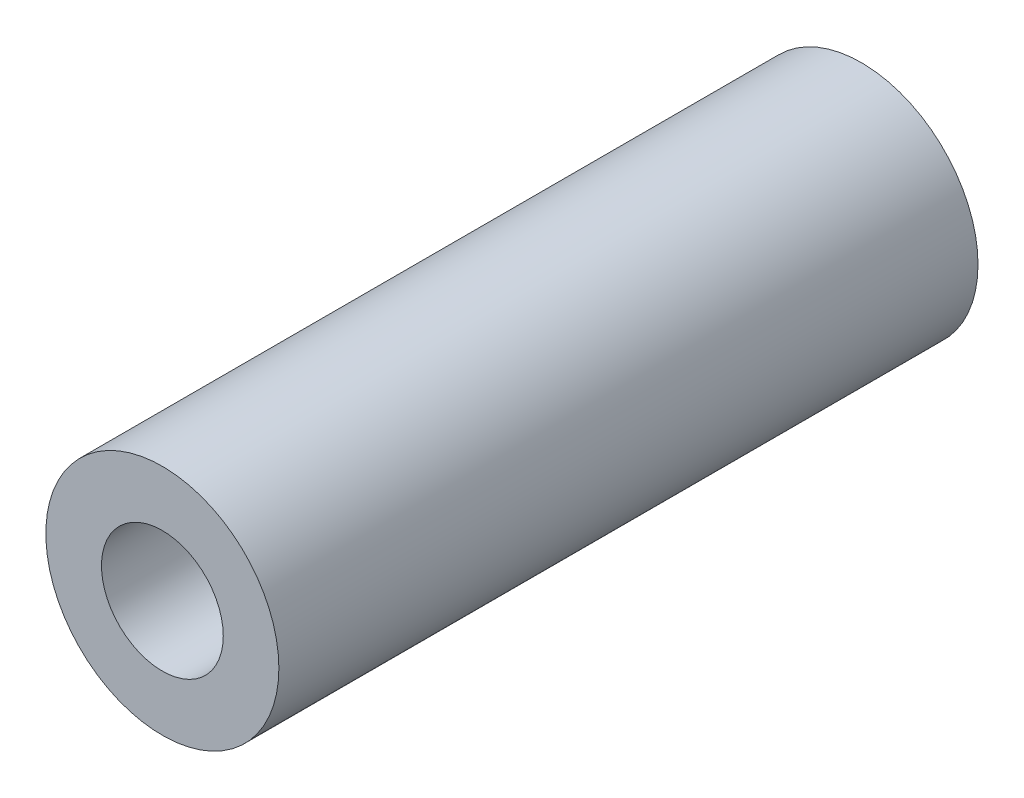
ISO-10303-21;
HEADER;
FILE_DESCRIPTION(('STEP AP214'),'2;1');
FILE_NAME('part.step','',(''),(''),'','','');
FILE_SCHEMA(('AUTOMOTIVE_DESIGN { 1 0 10303 214 1 1 1 1 }'));
ENDSEC;
DATA;
#1=APPLICATION_CONTEXT('core data for automotive mechanical design processes');
#2=APPLICATION_PROTOCOL_DEFINITION('international standard','automotive_design',2000,#1);
#3=PRODUCT_CONTEXT('',#1,'mechanical');
#4=PRODUCT('Part','Part','',(#3));
#5=PRODUCT_RELATED_PRODUCT_CATEGORY('part','',(#4));
#6=PRODUCT_DEFINITION_FORMATION('','',#4);
#7=PRODUCT_DEFINITION_CONTEXT('part definition',#1,'design');
#8=PRODUCT_DEFINITION('design','',#6,#7);
#9=PRODUCT_DEFINITION_SHAPE('','',#8);
#10=(LENGTH_UNIT() NAMED_UNIT(*) SI_UNIT(.MILLI.,.METRE.));
#11=(NAMED_UNIT(*) PLANE_ANGLE_UNIT() SI_UNIT($,.RADIAN.));
#12=(NAMED_UNIT(*) SI_UNIT($,.STERADIAN.) SOLID_ANGLE_UNIT());
#13=UNCERTAINTY_MEASURE_WITH_UNIT(LENGTH_MEASURE(1.E-05),#10,'distance_accuracy_value','');
#14=(GEOMETRIC_REPRESENTATION_CONTEXT(3) GLOBAL_UNCERTAINTY_ASSIGNED_CONTEXT((#13)) GLOBAL_UNIT_ASSIGNED_CONTEXT((#10,
#11,#12)) REPRESENTATION_CONTEXT('',''));
#15=CARTESIAN_POINT('',(0.,0.,0.));
#16=DIRECTION('',(0.,0.,1.));
#17=DIRECTION('',(1.,0.,0.));
#18=AXIS2_PLACEMENT_3D('',#15,#16,#17);
#19=CARTESIAN_POINT('',(0.,0.,28.575));
#20=DIRECTION('',(0.,0.,1.));
#21=DIRECTION('',(1.,0.,0.));
#22=AXIS2_PLACEMENT_3D('',#19,#20,#21);
#23=PLANE('',#22);
#24=CARTESIAN_POINT('',(0.,0.,28.575));
#25=DIRECTION('',(0.,0.,1.));
#26=DIRECTION('',(1.,0.,0.));
#27=AXIS2_PLACEMENT_3D('',#24,#25,#26);
#28=CIRCLE('',#27,4.7625);
#29=CARTESIAN_POINT('',(4.7625,0.,28.575));
#30=VERTEX_POINT('',#29);
#31=EDGE_CURVE('E10',#30,#30,#28,.T.);
#32=ORIENTED_EDGE('',*,*,#31,.T.);
#33=EDGE_LOOP('',(#32));
#34=FACE_BOUND('',#33,.T.);
#35=CARTESIAN_POINT('',(0.,0.,28.575));
#36=DIRECTION('',(0.,0.,1.));
#37=DIRECTION('',(1.,0.,0.));
#38=AXIS2_PLACEMENT_3D('',#35,#36,#37);
#39=CIRCLE('',#38,2.4892);
#40=CARTESIAN_POINT('',(2.4892,0.,28.575));
#41=VERTEX_POINT('',#40);
#42=EDGE_CURVE('E49',#41,#41,#39,.T.);
#43=ORIENTED_EDGE('',*,*,#42,.F.);
#44=EDGE_LOOP('',(#43));
#45=FACE_BOUND('',#44,.T.);
#46=ADVANCED_FACE('F35',(#34,#45),#23,.T.);
#47=CARTESIAN_POINT('',(0.,0.,0.));
#48=DIRECTION('',(0.,0.,1.));
#49=DIRECTION('',(1.,0.,0.));
#50=AXIS2_PLACEMENT_3D('',#47,#48,#49);
#51=PLANE('',#50);
#52=CARTESIAN_POINT('',(0.,0.,0.));
#53=DIRECTION('',(0.,0.,1.));
#54=DIRECTION('',(1.,0.,0.));
#55=AXIS2_PLACEMENT_3D('',#52,#53,#54);
#56=CIRCLE('',#55,4.7625);
#57=CARTESIAN_POINT('',(4.7625,0.,0.));
#58=VERTEX_POINT('',#57);
#59=EDGE_CURVE('E39',#58,#58,#56,.T.);
#60=ORIENTED_EDGE('',*,*,#59,.F.);
#61=EDGE_LOOP('',(#60));
#62=FACE_BOUND('',#61,.T.);
#63=CARTESIAN_POINT('',(0.,0.,0.));
#64=DIRECTION('',(0.,0.,1.));
#65=DIRECTION('',(1.,0.,0.));
#66=AXIS2_PLACEMENT_3D('',#63,#64,#65);
#67=CIRCLE('',#66,2.4892);
#68=CARTESIAN_POINT('',(2.4892,0.,0.));
#69=VERTEX_POINT('',#68);
#70=EDGE_CURVE('E51',#69,#69,#67,.T.);
#71=ORIENTED_EDGE('',*,*,#70,.T.);
#72=EDGE_LOOP('',(#71));
#73=FACE_BOUND('',#72,.T.);
#74=ADVANCED_FACE('F64',(#62,#73),#51,.F.);
#75=CARTESIAN_POINT('',(0.,0.,28.575));
#76=DIRECTION('',(0.,0.,-1.));
#77=DIRECTION('',(-1.,0.,0.));
#78=AXIS2_PLACEMENT_3D('',#75,#76,#77);
#79=CYLINDRICAL_SURFACE('',#78,4.7625);
#80=ORIENTED_EDGE('',*,*,#31,.F.);
#81=EDGE_LOOP('',(#80));
#82=FACE_BOUND('',#81,.T.);
#83=ORIENTED_EDGE('',*,*,#59,.T.);
#84=EDGE_LOOP('',(#83));
#85=FACE_BOUND('',#84,.T.);
#86=ADVANCED_FACE('F37',(#82,#85),#79,.T.);
#87=CARTESIAN_POINT('',(0.,0.,28.575));
#88=DIRECTION('',(0.,0.,-1.));
#89=DIRECTION('',(-1.,0.,0.));
#90=AXIS2_PLACEMENT_3D('',#87,#88,#89);
#91=CYLINDRICAL_SURFACE('',#90,2.4892);
#92=ORIENTED_EDGE('',*,*,#42,.T.);
#93=EDGE_LOOP('',(#92));
#94=FACE_BOUND('',#93,.T.);
#95=ORIENTED_EDGE('',*,*,#70,.F.);
#96=EDGE_LOOP('',(#95));
#97=FACE_BOUND('',#96,.T.);
#98=ADVANCED_FACE('F60',(#94,#97),#91,.F.);
#99=CLOSED_SHELL('',(#46,#74,#86,#98));
#100=MANIFOLD_SOLID_BREP('B2',#99);
#101=ADVANCED_BREP_SHAPE_REPRESENTATION('',(#18,#100),#14);
#102=SHAPE_DEFINITION_REPRESENTATION(#9,#101);
ENDSEC;
END-ISO-10303-21;
